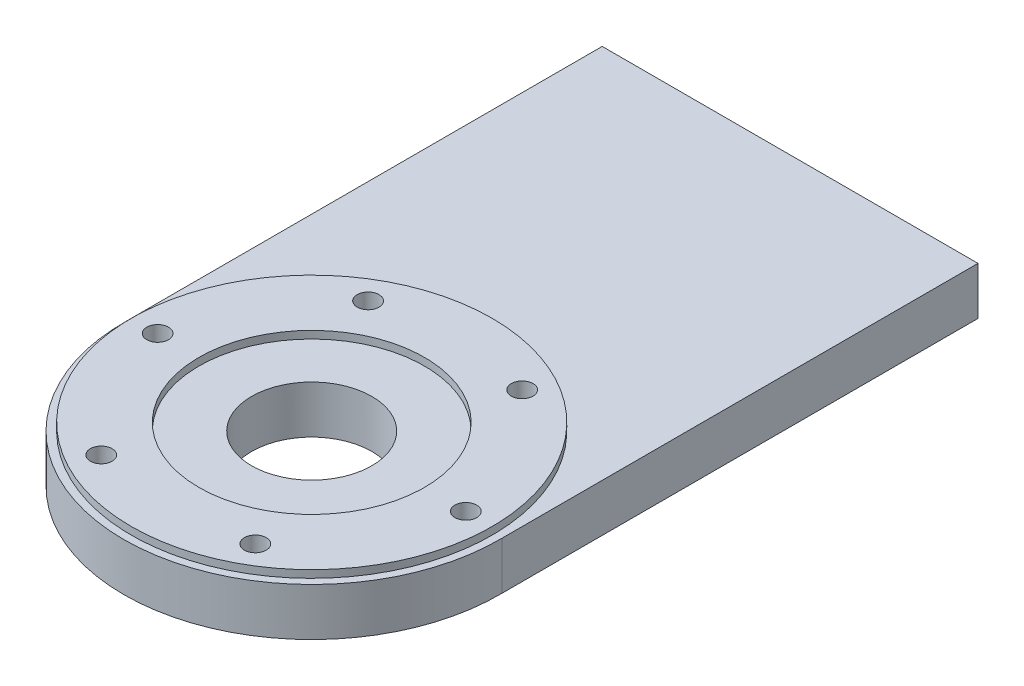
ISO-10303-21;
HEADER;
FILE_DESCRIPTION(('STEP AP214'),'2;1');
FILE_NAME('part.step','',(''),(''),'','','');
FILE_SCHEMA(('AUTOMOTIVE_DESIGN { 1 0 10303 214 1 1 1 1 }'));
ENDSEC;
DATA;
#1=APPLICATION_CONTEXT('core data for automotive mechanical design processes');
#2=APPLICATION_PROTOCOL_DEFINITION('international standard','automotive_design',2000,#1);
#3=PRODUCT_CONTEXT('',#1,'mechanical');
#4=PRODUCT('Part','Part','',(#3));
#5=PRODUCT_RELATED_PRODUCT_CATEGORY('part','',(#4));
#6=PRODUCT_DEFINITION_FORMATION('','',#4);
#7=PRODUCT_DEFINITION_CONTEXT('part definition',#1,'design');
#8=PRODUCT_DEFINITION('design','',#6,#7);
#9=PRODUCT_DEFINITION_SHAPE('','',#8);
#10=(LENGTH_UNIT() NAMED_UNIT(*) SI_UNIT(.MILLI.,.METRE.));
#11=(NAMED_UNIT(*) PLANE_ANGLE_UNIT() SI_UNIT($,.RADIAN.));
#12=(NAMED_UNIT(*) SI_UNIT($,.STERADIAN.) SOLID_ANGLE_UNIT());
#13=UNCERTAINTY_MEASURE_WITH_UNIT(LENGTH_MEASURE(1.E-05),#10,'distance_accuracy_value','');
#14=(GEOMETRIC_REPRESENTATION_CONTEXT(3) GLOBAL_UNCERTAINTY_ASSIGNED_CONTEXT((#13)) GLOBAL_UNIT_ASSIGNED_CONTEXT((#10,
#11,#12)) REPRESENTATION_CONTEXT('',''));
#15=CARTESIAN_POINT('',(0.,0.,0.));
#16=DIRECTION('',(0.,0.,1.));
#17=DIRECTION('',(1.,0.,0.));
#18=AXIS2_PLACEMENT_3D('',#15,#16,#17);
#19=CARTESIAN_POINT('',(-25.,-21.5,489.65));
#20=DIRECTION('',(0.,0.,-1.));
#21=DIRECTION('',(-1.,0.,0.));
#22=AXIS2_PLACEMENT_3D('',#19,#20,#21);
#23=PLANE('',#22);
#24=DIRECTION('',(0.,-1.,0.));
#25=VECTOR('',#24,1.);
#26=CARTESIAN_POINT('',(24.9975498799382,-21.5,489.65));
#27=LINE('',#26,#25);
#28=CARTESIAN_POINT('',(24.9975498799382,-27.85,489.65));
#29=VERTEX_POINT('',#28);
#30=CARTESIAN_POINT('',(24.9975498799382,-21.5,489.65));
#31=VERTEX_POINT('',#30);
#32=EDGE_CURVE('E111',#29,#31,#27,.F.);
#33=ORIENTED_EDGE('',*,*,#32,.F.);
#34=DIRECTION('',(1.,0.,0.));
#35=VECTOR('',#34,1.);
#36=CARTESIAN_POINT('',(-25.,-27.85,489.65));
#37=LINE('',#36,#35);
#38=CARTESIAN_POINT('',(25.,-27.85,489.65));
#39=VERTEX_POINT('',#38);
#40=EDGE_CURVE('E105',#29,#39,#37,.T.);
#41=ORIENTED_EDGE('',*,*,#40,.T.);
#42=DIRECTION('',(0.,-1.,0.));
#43=VECTOR('',#42,1.);
#44=CARTESIAN_POINT('',(25.,-21.5,489.65));
#45=LINE('',#44,#43);
#46=CARTESIAN_POINT('',(25.,-21.5,489.65));
#47=VERTEX_POINT('',#46);
#48=EDGE_CURVE('E133',#47,#39,#45,.T.);
#49=ORIENTED_EDGE('',*,*,#48,.F.);
#50=DIRECTION('',(1.,0.,0.));
#51=VECTOR('',#50,1.);
#52=CARTESIAN_POINT('',(-25.,-21.5,489.65));
#53=LINE('',#52,#51);
#54=EDGE_CURVE('E57',#31,#47,#53,.T.);
#55=ORIENTED_EDGE('',*,*,#54,.F.);
#56=EDGE_LOOP('',(#33,#41,#49,#55));
#57=FACE_BOUND('',#56,.T.);
#58=ADVANCED_FACE('F39',(#57),#23,.F.);
#59=DIRECTION('',(0.,-1.,0.));
#60=VECTOR('',#59,1.);
#61=CARTESIAN_POINT('',(-24.9975498799382,-21.5,489.65));
#62=LINE('',#61,#60);
#63=CARTESIAN_POINT('',(-24.9975498799382,-21.5,489.65));
#64=VERTEX_POINT('',#63);
#65=CARTESIAN_POINT('',(-24.9975498799382,-27.85,489.65));
#66=VERTEX_POINT('',#65);
#67=EDGE_CURVE('E64',#64,#66,#62,.T.);
#68=ORIENTED_EDGE('',*,*,#67,.F.);
#69=CARTESIAN_POINT('',(-25.,-21.5,489.65));
#70=VERTEX_POINT('',#69);
#71=EDGE_CURVE('E131',#70,#64,#53,.T.);
#72=ORIENTED_EDGE('',*,*,#71,.F.);
#73=DIRECTION('',(0.,-1.,0.));
#74=VECTOR('',#73,1.);
#75=CARTESIAN_POINT('',(-25.,-21.5,489.65));
#76=LINE('',#75,#74);
#77=CARTESIAN_POINT('',(-25.,-27.85,489.65));
#78=VERTEX_POINT('',#77);
#79=EDGE_CURVE('E97',#70,#78,#76,.T.);
#80=ORIENTED_EDGE('',*,*,#79,.T.);
#81=EDGE_CURVE('E94',#78,#66,#37,.T.);
#82=ORIENTED_EDGE('',*,*,#81,.T.);
#83=EDGE_LOOP('',(#68,#72,#80,#82));
#84=FACE_BOUND('',#83,.T.);
#85=ADVANCED_FACE('F91',(#84),#23,.F.);
#86=CARTESIAN_POINT('',(25.,-21.5,489.65));
#87=DIRECTION('',(-1.,0.,0.));
#88=DIRECTION('',(0.,0.,1.));
#89=AXIS2_PLACEMENT_3D('',#86,#87,#88);
#90=PLANE('',#89);
#91=DIRECTION('',(0.,0.,-1.));
#92=VECTOR('',#91,1.);
#93=CARTESIAN_POINT('',(25.,-27.85,489.65));
#94=LINE('',#93,#92);
#95=CARTESIAN_POINT('',(25.,-27.85,426.35));
#96=VERTEX_POINT('',#95);
#97=EDGE_CURVE('E121',#39,#96,#94,.T.);
#98=ORIENTED_EDGE('',*,*,#97,.T.);
#99=DIRECTION('',(0.,-1.,0.));
#100=VECTOR('',#99,1.);
#101=CARTESIAN_POINT('',(25.,-21.5,426.35));
#102=LINE('',#101,#100);
#103=CARTESIAN_POINT('',(25.,-21.5,426.35));
#104=VERTEX_POINT('',#103);
#105=EDGE_CURVE('E48',#104,#96,#102,.T.);
#106=ORIENTED_EDGE('',*,*,#105,.F.);
#107=DIRECTION('',(0.,0.,-1.));
#108=VECTOR('',#107,1.);
#109=CARTESIAN_POINT('',(25.,-21.5,489.65));
#110=LINE('',#109,#108);
#111=EDGE_CURVE('E103',#47,#104,#110,.T.);
#112=ORIENTED_EDGE('',*,*,#111,.F.);
#113=ORIENTED_EDGE('',*,*,#48,.T.);
#114=EDGE_LOOP('',(#98,#106,#112,#113));
#115=FACE_BOUND('',#114,.T.);
#116=ADVANCED_FACE('F41',(#115),#90,.F.);
#117=CARTESIAN_POINT('',(-25.,-21.5,426.35));
#118=DIRECTION('',(0.,0.,1.));
#119=DIRECTION('',(1.,0.,0.));
#120=AXIS2_PLACEMENT_3D('',#117,#118,#119);
#121=PLANE('',#120);
#122=CARTESIAN_POINT('',(-15.,-24.675,426.35));
#123=DIRECTION('',(0.,0.,-1.));
#124=DIRECTION('',(-1.,0.,0.));
#125=AXIS2_PLACEMENT_3D('',#122,#123,#124);
#126=CIRCLE('',#125,1.25);
#127=CARTESIAN_POINT('',(-16.25,-24.675,426.35));
#128=VERTEX_POINT('',#127);
#129=EDGE_CURVE('E245',#128,#128,#126,.T.);
#130=ORIENTED_EDGE('',*,*,#129,.F.);
#131=EDGE_LOOP('',(#130));
#132=FACE_BOUND('',#131,.T.);
#133=CARTESIAN_POINT('',(15.,-24.675,426.35));
#134=DIRECTION('',(0.,0.,-1.));
#135=DIRECTION('',(-1.,0.,0.));
#136=AXIS2_PLACEMENT_3D('',#133,#134,#135);
#137=CIRCLE('',#136,1.25);
#138=CARTESIAN_POINT('',(13.75,-24.675,426.35));
#139=VERTEX_POINT('',#138);
#140=EDGE_CURVE('E246',#139,#139,#137,.T.);
#141=ORIENTED_EDGE('',*,*,#140,.F.);
#142=EDGE_LOOP('',(#141));
#143=FACE_BOUND('',#142,.T.);
#144=DIRECTION('',(-1.,0.,0.));
#145=VECTOR('',#144,1.);
#146=CARTESIAN_POINT('',(-25.,-27.85,426.35));
#147=LINE('',#146,#145);
#148=CARTESIAN_POINT('',(-25.,-27.85,426.35));
#149=VERTEX_POINT('',#148);
#150=EDGE_CURVE('E137',#96,#149,#147,.T.);
#151=ORIENTED_EDGE('',*,*,#150,.T.);
#152=DIRECTION('',(0.,-1.,0.));
#153=VECTOR('',#152,1.);
#154=CARTESIAN_POINT('',(-25.,-21.5,426.35));
#155=LINE('',#154,#153);
#156=CARTESIAN_POINT('',(-25.,-21.5,426.35));
#157=VERTEX_POINT('',#156);
#158=EDGE_CURVE('E141',#157,#149,#155,.T.);
#159=ORIENTED_EDGE('',*,*,#158,.F.);
#160=DIRECTION('',(-1.,0.,0.));
#161=VECTOR('',#160,1.);
#162=CARTESIAN_POINT('',(-25.,-21.5,426.35));
#163=LINE('',#162,#161);
#164=EDGE_CURVE('E130',#104,#157,#163,.T.);
#165=ORIENTED_EDGE('',*,*,#164,.F.);
#166=ORIENTED_EDGE('',*,*,#105,.T.);
#167=EDGE_LOOP('',(#151,#159,#165,#166));
#168=FACE_BOUND('',#167,.T.);
#169=ADVANCED_FACE('F229',(#132,#143,#168),#121,.F.);
#170=CARTESIAN_POINT('',(-25.,-21.5,489.65));
#171=DIRECTION('',(1.,0.,0.));
#172=DIRECTION('',(0.,0.,-1.));
#173=AXIS2_PLACEMENT_3D('',#170,#171,#172);
#174=PLANE('',#173);
#175=DIRECTION('',(0.,0.,1.));
#176=VECTOR('',#175,1.);
#177=CARTESIAN_POINT('',(-25.,-27.85,489.65));
#178=LINE('',#177,#176);
#179=EDGE_CURVE('E138',#149,#78,#178,.T.);
#180=ORIENTED_EDGE('',*,*,#179,.T.);
#181=ORIENTED_EDGE('',*,*,#79,.F.);
#182=DIRECTION('',(0.,0.,1.));
#183=VECTOR('',#182,1.);
#184=CARTESIAN_POINT('',(-25.,-21.5,489.65));
#185=LINE('',#184,#183);
#186=EDGE_CURVE('E129',#157,#70,#185,.T.);
#187=ORIENTED_EDGE('',*,*,#186,.F.);
#188=ORIENTED_EDGE('',*,*,#158,.T.);
#189=EDGE_LOOP('',(#180,#181,#187,#188));
#190=FACE_BOUND('',#189,.T.);
#191=ADVANCED_FACE('F226',(#190),#174,.F.);
#192=CARTESIAN_POINT('',(0.,-21.5,0.));
#193=DIRECTION('',(0.,-1.,0.));
#194=DIRECTION('',(0.,0.,-1.));
#195=AXIS2_PLACEMENT_3D('',#192,#193,#194);
#196=PLANE('',#195);
#197=CARTESIAN_POINT('',(0.,-21.5,490.));
#198=DIRECTION('',(0.,-1.,0.));
#199=DIRECTION('',(0.,0.,-1.));
#200=AXIS2_PLACEMENT_3D('',#197,#198,#199);
#201=CIRCLE('',#200,24.);
#202=CARTESIAN_POINT('',(0.,-21.5,466.));
#203=VERTEX_POINT('',#202);
#204=EDGE_CURVE('E11',#203,#203,#201,.F.);
#205=ORIENTED_EDGE('',*,*,#204,.F.);
#206=EDGE_LOOP('',(#205));
#207=FACE_BOUND('',#206,.T.);
#208=ORIENTED_EDGE('',*,*,#71,.T.);
#209=CARTESIAN_POINT('',(0.,-21.5,490.));
#210=DIRECTION('',(0.,1.,0.));
#211=DIRECTION('',(0.,0.,1.));
#212=AXIS2_PLACEMENT_3D('',#209,#210,#211);
#213=CIRCLE('',#212,25.);
#214=EDGE_CURVE('E109',#64,#31,#213,.T.);
#215=ORIENTED_EDGE('',*,*,#214,.T.);
#216=ORIENTED_EDGE('',*,*,#54,.T.);
#217=ORIENTED_EDGE('',*,*,#111,.T.);
#218=ORIENTED_EDGE('',*,*,#164,.T.);
#219=ORIENTED_EDGE('',*,*,#186,.T.);
#220=EDGE_LOOP('',(#208,#215,#216,#217,#218,#219));
#221=FACE_BOUND('',#220,.T.);
#222=ADVANCED_FACE('F214',(#207,#221),#196,.F.);
#223=CARTESIAN_POINT('',(0.,-27.85,0.));
#224=DIRECTION('',(0.,-1.,0.));
#225=DIRECTION('',(0.,0.,-1.));
#226=AXIS2_PLACEMENT_3D('',#223,#224,#225);
#227=PLANE('',#226);
#228=CARTESIAN_POINT('',(10.25,-27.85,472.246479222419));
#229=DIRECTION('',(0.,1.,0.));
#230=DIRECTION('',(0.,0.,1.));
#231=AXIS2_PLACEMENT_3D('',#228,#229,#230);
#232=CIRCLE('',#231,2.75);
#233=CARTESIAN_POINT('',(10.25,-27.85,474.996479222419));
#234=VERTEX_POINT('',#233);
#235=EDGE_CURVE('E328',#234,#234,#232,.T.);
#236=ORIENTED_EDGE('',*,*,#235,.T.);
#237=EDGE_LOOP('',(#236));
#238=FACE_BOUND('',#237,.T.);
#239=CARTESIAN_POINT('',(-10.25,-27.85,472.246479222419));
#240=DIRECTION('',(0.,1.,0.));
#241=DIRECTION('',(0.,0.,1.));
#242=AXIS2_PLACEMENT_3D('',#239,#240,#241);
#243=CIRCLE('',#242,2.75);
#244=CARTESIAN_POINT('',(-10.25,-27.85,474.996479222419));
#245=VERTEX_POINT('',#244);
#246=EDGE_CURVE('E330',#245,#245,#243,.T.);
#247=ORIENTED_EDGE('',*,*,#246,.T.);
#248=EDGE_LOOP('',(#247));
#249=FACE_BOUND('',#248,.T.);
#250=CARTESIAN_POINT('',(-10.25,-27.85,507.753520777581));
#251=DIRECTION('',(0.,1.,0.));
#252=DIRECTION('',(0.,0.,1.));
#253=AXIS2_PLACEMENT_3D('',#250,#251,#252);
#254=CIRCLE('',#253,2.75);
#255=CARTESIAN_POINT('',(-10.25,-27.85,510.503520777581));
#256=VERTEX_POINT('',#255);
#257=EDGE_CURVE('E342',#256,#256,#254,.T.);
#258=ORIENTED_EDGE('',*,*,#257,.T.);
#259=EDGE_LOOP('',(#258));
#260=FACE_BOUND('',#259,.T.);
#261=CARTESIAN_POINT('',(10.25,-27.85,507.753520777581));
#262=DIRECTION('',(0.,1.,0.));
#263=DIRECTION('',(0.,0.,1.));
#264=AXIS2_PLACEMENT_3D('',#261,#262,#263);
#265=CIRCLE('',#264,2.75);
#266=CARTESIAN_POINT('',(10.25,-27.85,510.503520777581));
#267=VERTEX_POINT('',#266);
#268=EDGE_CURVE('E341',#267,#267,#265,.T.);
#269=ORIENTED_EDGE('',*,*,#268,.T.);
#270=EDGE_LOOP('',(#269));
#271=FACE_BOUND('',#270,.T.);
#272=CARTESIAN_POINT('',(20.5,-27.85,490.));
#273=DIRECTION('',(0.,1.,0.));
#274=DIRECTION('',(0.,0.,1.));
#275=AXIS2_PLACEMENT_3D('',#272,#273,#274);
#276=CIRCLE('',#275,1.45);
#277=CARTESIAN_POINT('',(20.5,-27.85,491.45));
#278=VERTEX_POINT('',#277);
#279=EDGE_CURVE('E180',#278,#278,#276,.T.);
#280=ORIENTED_EDGE('',*,*,#279,.T.);
#281=EDGE_LOOP('',(#280));
#282=FACE_BOUND('',#281,.T.);
#283=CARTESIAN_POINT('',(-20.5,-27.85,490.));
#284=DIRECTION('',(0.,1.,0.));
#285=DIRECTION('',(0.,0.,1.));
#286=AXIS2_PLACEMENT_3D('',#283,#284,#285);
#287=CIRCLE('',#286,1.45);
#288=CARTESIAN_POINT('',(-20.5,-27.85,491.45));
#289=VERTEX_POINT('',#288);
#290=EDGE_CURVE('E184',#289,#289,#287,.T.);
#291=ORIENTED_EDGE('',*,*,#290,.T.);
#292=EDGE_LOOP('',(#291));
#293=FACE_BOUND('',#292,.T.);
#294=CARTESIAN_POINT('',(0.,-27.85,490.));
#295=DIRECTION('',(0.,1.,0.));
#296=DIRECTION('',(0.,0.,1.));
#297=AXIS2_PLACEMENT_3D('',#294,#295,#296);
#298=CIRCLE('',#297,8.);
#299=CARTESIAN_POINT('',(0.,-27.85,498.));
#300=VERTEX_POINT('',#299);
#301=EDGE_CURVE('E155',#300,#300,#298,.T.);
#302=ORIENTED_EDGE('',*,*,#301,.T.);
#303=EDGE_LOOP('',(#302));
#304=FACE_BOUND('',#303,.T.);
#305=ORIENTED_EDGE('',*,*,#40,.F.);
#306=CARTESIAN_POINT('',(0.,-27.85,490.));
#307=DIRECTION('',(0.,1.,0.));
#308=DIRECTION('',(0.,0.,1.));
#309=AXIS2_PLACEMENT_3D('',#306,#307,#308);
#310=CIRCLE('',#309,25.);
#311=EDGE_CURVE('E108',#66,#29,#310,.T.);
#312=ORIENTED_EDGE('',*,*,#311,.F.);
#313=ORIENTED_EDGE('',*,*,#81,.F.);
#314=ORIENTED_EDGE('',*,*,#179,.F.);
#315=ORIENTED_EDGE('',*,*,#150,.F.);
#316=ORIENTED_EDGE('',*,*,#97,.F.);
#317=EDGE_LOOP('',(#305,#312,#313,#314,#315,#316));
#318=FACE_BOUND('',#317,.T.);
#319=ADVANCED_FACE('F112',(#238,#249,#260,#271,#282,#293,#304,#318),#227,.T.);
#320=CARTESIAN_POINT('',(0.,-21.5,490.));
#321=DIRECTION('',(0.,-1.,0.));
#322=DIRECTION('',(0.,0.,-1.));
#323=AXIS2_PLACEMENT_3D('',#320,#321,#322);
#324=CYLINDRICAL_SURFACE('',#323,25.);
#325=ORIENTED_EDGE('',*,*,#311,.T.);
#326=ORIENTED_EDGE('',*,*,#32,.T.);
#327=ORIENTED_EDGE('',*,*,#214,.F.);
#328=ORIENTED_EDGE('',*,*,#67,.T.);
#329=EDGE_LOOP('',(#325,#326,#327,#328));
#330=FACE_BOUND('',#329,.T.);
#331=ADVANCED_FACE('F110',(#330),#324,.T.);
#332=CARTESIAN_POINT('',(0.,-20.5,490.));
#333=DIRECTION('',(0.,1.,0.));
#334=DIRECTION('',(0.,0.,1.));
#335=AXIS2_PLACEMENT_3D('',#332,#333,#334);
#336=PLANE('',#335);
#337=CARTESIAN_POINT('',(20.5,-20.5,490.));
#338=DIRECTION('',(0.,1.,0.));
#339=DIRECTION('',(0.,0.,1.));
#340=AXIS2_PLACEMENT_3D('',#337,#338,#339);
#341=CIRCLE('',#340,1.45);
#342=CARTESIAN_POINT('',(20.5,-20.5,491.45));
#343=VERTEX_POINT('',#342);
#344=EDGE_CURVE('E195',#343,#343,#341,.T.);
#345=ORIENTED_EDGE('',*,*,#344,.F.);
#346=EDGE_LOOP('',(#345));
#347=FACE_BOUND('',#346,.T.);
#348=CARTESIAN_POINT('',(10.25,-20.5,472.246479222419));
#349=DIRECTION('',(0.,1.,0.));
#350=DIRECTION('',(0.,0.,1.));
#351=AXIS2_PLACEMENT_3D('',#348,#349,#350);
#352=CIRCLE('',#351,1.45);
#353=CARTESIAN_POINT('',(10.25,-20.5,473.696479222419));
#354=VERTEX_POINT('',#353);
#355=EDGE_CURVE('E165',#354,#354,#352,.T.);
#356=ORIENTED_EDGE('',*,*,#355,.F.);
#357=EDGE_LOOP('',(#356));
#358=FACE_BOUND('',#357,.T.);
#359=CARTESIAN_POINT('',(-10.25,-20.5,472.246479222419));
#360=DIRECTION('',(0.,1.,0.));
#361=DIRECTION('',(0.,0.,1.));
#362=AXIS2_PLACEMENT_3D('',#359,#360,#361);
#363=CIRCLE('',#362,1.45);
#364=CARTESIAN_POINT('',(-10.25,-20.5,473.696479222419));
#365=VERTEX_POINT('',#364);
#366=EDGE_CURVE('E166',#365,#365,#363,.T.);
#367=ORIENTED_EDGE('',*,*,#366,.F.);
#368=EDGE_LOOP('',(#367));
#369=FACE_BOUND('',#368,.T.);
#370=CARTESIAN_POINT('',(-20.5,-20.5,490.));
#371=DIRECTION('',(0.,1.,0.));
#372=DIRECTION('',(0.,0.,1.));
#373=AXIS2_PLACEMENT_3D('',#370,#371,#372);
#374=CIRCLE('',#373,1.45);
#375=CARTESIAN_POINT('',(-20.5,-20.5,491.45));
#376=VERTEX_POINT('',#375);
#377=EDGE_CURVE('E173',#376,#376,#374,.T.);
#378=ORIENTED_EDGE('',*,*,#377,.F.);
#379=EDGE_LOOP('',(#378));
#380=FACE_BOUND('',#379,.T.);
#381=CARTESIAN_POINT('',(-10.25,-20.5,507.753520777581));
#382=DIRECTION('',(0.,1.,0.));
#383=DIRECTION('',(0.,0.,1.));
#384=AXIS2_PLACEMENT_3D('',#381,#382,#383);
#385=CIRCLE('',#384,1.45);
#386=CARTESIAN_POINT('',(-10.25,-20.5,509.203520777581));
#387=VERTEX_POINT('',#386);
#388=EDGE_CURVE('E185',#387,#387,#385,.T.);
#389=ORIENTED_EDGE('',*,*,#388,.F.);
#390=EDGE_LOOP('',(#389));
#391=FACE_BOUND('',#390,.T.);
#392=CARTESIAN_POINT('',(10.25,-20.5,507.753520777581));
#393=DIRECTION('',(0.,1.,0.));
#394=DIRECTION('',(0.,0.,1.));
#395=AXIS2_PLACEMENT_3D('',#392,#393,#394);
#396=CIRCLE('',#395,1.45);
#397=CARTESIAN_POINT('',(10.25,-20.5,509.203520777581));
#398=VERTEX_POINT('',#397);
#399=EDGE_CURVE('E177',#398,#398,#396,.T.);
#400=ORIENTED_EDGE('',*,*,#399,.F.);
#401=EDGE_LOOP('',(#400));
#402=FACE_BOUND('',#401,.T.);
#403=CARTESIAN_POINT('',(0.,-20.5,490.));
#404=DIRECTION('',(0.,1.,0.));
#405=DIRECTION('',(0.,0.,1.));
#406=AXIS2_PLACEMENT_3D('',#403,#404,#405);
#407=CIRCLE('',#406,24.);
#408=CARTESIAN_POINT('',(0.,-20.5,514.));
#409=VERTEX_POINT('',#408);
#410=EDGE_CURVE('E116',#409,#409,#407,.T.);
#411=ORIENTED_EDGE('',*,*,#410,.T.);
#412=EDGE_LOOP('',(#411));
#413=FACE_BOUND('',#412,.T.);
#414=CARTESIAN_POINT('',(0.,-20.5,490.));
#415=DIRECTION('',(0.,1.,0.));
#416=DIRECTION('',(0.,0.,1.));
#417=AXIS2_PLACEMENT_3D('',#414,#415,#416);
#418=CIRCLE('',#417,15.);
#419=CARTESIAN_POINT('',(0.,-20.5,505.));
#420=VERTEX_POINT('',#419);
#421=EDGE_CURVE('E119',#420,#420,#418,.T.);
#422=ORIENTED_EDGE('',*,*,#421,.F.);
#423=EDGE_LOOP('',(#422));
#424=FACE_BOUND('',#423,.T.);
#425=ADVANCED_FACE('F212',(#347,#358,#369,#380,#391,#402,#413,#424),#336,.T.);
#426=CARTESIAN_POINT('',(0.,-20.5,490.));
#427=DIRECTION('',(0.,-1.,0.));
#428=DIRECTION('',(0.,0.,-1.));
#429=AXIS2_PLACEMENT_3D('',#426,#427,#428);
#430=CYLINDRICAL_SURFACE('',#429,24.);
#431=ORIENTED_EDGE('',*,*,#410,.F.);
#432=EDGE_LOOP('',(#431));
#433=FACE_BOUND('',#432,.T.);
#434=ORIENTED_EDGE('',*,*,#204,.T.);
#435=EDGE_LOOP('',(#434));
#436=FACE_BOUND('',#435,.T.);
#437=ADVANCED_FACE('F205',(#433,#436),#430,.T.);
#438=CARTESIAN_POINT('',(0.,-20.5,490.));
#439=DIRECTION('',(0.,-1.,0.));
#440=DIRECTION('',(0.,0.,-1.));
#441=AXIS2_PLACEMENT_3D('',#438,#439,#440);
#442=CYLINDRICAL_SURFACE('',#441,15.);
#443=ORIENTED_EDGE('',*,*,#421,.T.);
#444=EDGE_LOOP('',(#443));
#445=FACE_BOUND('',#444,.T.);
#446=CARTESIAN_POINT('',(0.,-21.5,490.));
#447=DIRECTION('',(0.,1.,0.));
#448=DIRECTION('',(0.,0.,1.));
#449=AXIS2_PLACEMENT_3D('',#446,#447,#448);
#450=CIRCLE('',#449,15.);
#451=CARTESIAN_POINT('',(0.,-21.5,505.));
#452=VERTEX_POINT('',#451);
#453=EDGE_CURVE('E151',#452,#452,#450,.T.);
#454=ORIENTED_EDGE('',*,*,#453,.F.);
#455=EDGE_LOOP('',(#454));
#456=FACE_BOUND('',#455,.T.);
#457=ADVANCED_FACE('F199',(#445,#456),#442,.F.);
#458=CARTESIAN_POINT('',(0.,-21.5,490.));
#459=DIRECTION('',(0.,-1.,0.));
#460=DIRECTION('',(0.,0.,-1.));
#461=AXIS2_PLACEMENT_3D('',#458,#459,#460);
#462=CIRCLE('',#461,8.);
#463=CARTESIAN_POINT('',(0.,-21.5,482.));
#464=VERTEX_POINT('',#463);
#465=EDGE_CURVE('E146',#464,#464,#462,.F.);
#466=ORIENTED_EDGE('',*,*,#465,.F.);
#467=EDGE_LOOP('',(#466));
#468=FACE_BOUND('',#467,.T.);
#469=ORIENTED_EDGE('',*,*,#453,.T.);
#470=EDGE_LOOP('',(#469));
#471=FACE_BOUND('',#470,.T.);
#472=ADVANCED_FACE('F198',(#468,#471),#196,.F.);
#473=CARTESIAN_POINT('',(0.,-20.5,490.));
#474=DIRECTION('',(0.,-1.,0.));
#475=DIRECTION('',(0.,0.,-1.));
#476=AXIS2_PLACEMENT_3D('',#473,#474,#475);
#477=CYLINDRICAL_SURFACE('',#476,8.);
#478=ORIENTED_EDGE('',*,*,#301,.F.);
#479=EDGE_LOOP('',(#478));
#480=FACE_BOUND('',#479,.T.);
#481=ORIENTED_EDGE('',*,*,#465,.T.);
#482=EDGE_LOOP('',(#481));
#483=FACE_BOUND('',#482,.T.);
#484=ADVANCED_FACE('F213',(#480,#483),#477,.F.);
#485=CARTESIAN_POINT('',(10.25,-20.5,507.753520777581));
#486=DIRECTION('',(0.,-1.,0.));
#487=DIRECTION('',(0.,0.,-1.));
#488=AXIS2_PLACEMENT_3D('',#485,#486,#487);
#489=CYLINDRICAL_SURFACE('',#488,1.45);
#490=CARTESIAN_POINT('',(10.25,-25.35,507.753520777581));
#491=DIRECTION('',(0.,1.,0.));
#492=DIRECTION('',(0.,0.,1.));
#493=AXIS2_PLACEMENT_3D('',#490,#491,#492);
#494=CIRCLE('',#493,1.45);
#495=CARTESIAN_POINT('',(10.25,-25.35,509.203520777581));
#496=VERTEX_POINT('',#495);
#497=EDGE_CURVE('E43',#496,#496,#494,.T.);
#498=ORIENTED_EDGE('',*,*,#497,.F.);
#499=EDGE_LOOP('',(#498));
#500=FACE_BOUND('',#499,.T.);
#501=ORIENTED_EDGE('',*,*,#399,.T.);
#502=EDGE_LOOP('',(#501));
#503=FACE_BOUND('',#502,.T.);
#504=ADVANCED_FACE('F284',(#500,#503),#489,.F.);
#505=CARTESIAN_POINT('',(-10.25,-20.5,507.753520777581));
#506=DIRECTION('',(0.,-1.,0.));
#507=DIRECTION('',(0.,0.,-1.));
#508=AXIS2_PLACEMENT_3D('',#505,#506,#507);
#509=CYLINDRICAL_SURFACE('',#508,1.45);
#510=CARTESIAN_POINT('',(-10.25,-25.35,507.753520777581));
#511=DIRECTION('',(0.,1.,0.));
#512=DIRECTION('',(0.,0.,1.));
#513=AXIS2_PLACEMENT_3D('',#510,#511,#512);
#514=CIRCLE('',#513,1.45);
#515=CARTESIAN_POINT('',(-10.25,-25.35,509.203520777581));
#516=VERTEX_POINT('',#515);
#517=EDGE_CURVE('E159',#516,#516,#514,.T.);
#518=ORIENTED_EDGE('',*,*,#517,.F.);
#519=EDGE_LOOP('',(#518));
#520=FACE_BOUND('',#519,.T.);
#521=ORIENTED_EDGE('',*,*,#388,.T.);
#522=EDGE_LOOP('',(#521));
#523=FACE_BOUND('',#522,.T.);
#524=ADVANCED_FACE('F290',(#520,#523),#509,.F.);
#525=CARTESIAN_POINT('',(-20.5,-20.5,490.));
#526=DIRECTION('',(0.,-1.,0.));
#527=DIRECTION('',(0.,0.,-1.));
#528=AXIS2_PLACEMENT_3D('',#525,#526,#527);
#529=CYLINDRICAL_SURFACE('',#528,1.45);
#530=ORIENTED_EDGE('',*,*,#377,.T.);
#531=EDGE_LOOP('',(#530));
#532=FACE_BOUND('',#531,.T.);
#533=ORIENTED_EDGE('',*,*,#290,.F.);
#534=EDGE_LOOP('',(#533));
#535=FACE_BOUND('',#534,.T.);
#536=ADVANCED_FACE('F295',(#532,#535),#529,.F.);
#537=CARTESIAN_POINT('',(-10.25,-20.5,472.246479222419));
#538=DIRECTION('',(0.,-1.,0.));
#539=DIRECTION('',(0.,0.,-1.));
#540=AXIS2_PLACEMENT_3D('',#537,#538,#539);
#541=CYLINDRICAL_SURFACE('',#540,1.45);
#542=CARTESIAN_POINT('',(-10.25,-25.35,472.246479222419));
#543=DIRECTION('',(0.,1.,0.));
#544=DIRECTION('',(0.,0.,1.));
#545=AXIS2_PLACEMENT_3D('',#542,#543,#544);
#546=CIRCLE('',#545,1.45);
#547=CARTESIAN_POINT('',(-10.25,-25.35,473.696479222419));
#548=VERTEX_POINT('',#547);
#549=EDGE_CURVE('E157',#548,#548,#546,.T.);
#550=ORIENTED_EDGE('',*,*,#549,.F.);
#551=EDGE_LOOP('',(#550));
#552=FACE_BOUND('',#551,.T.);
#553=ORIENTED_EDGE('',*,*,#366,.T.);
#554=EDGE_LOOP('',(#553));
#555=FACE_BOUND('',#554,.T.);
#556=ADVANCED_FACE('F302',(#552,#555),#541,.F.);
#557=CARTESIAN_POINT('',(10.25,-20.5,472.246479222419));
#558=DIRECTION('',(0.,-1.,0.));
#559=DIRECTION('',(0.,0.,-1.));
#560=AXIS2_PLACEMENT_3D('',#557,#558,#559);
#561=CYLINDRICAL_SURFACE('',#560,1.45);
#562=CARTESIAN_POINT('',(10.25,-25.35,472.246479222419));
#563=DIRECTION('',(0.,1.,0.));
#564=DIRECTION('',(0.,0.,1.));
#565=AXIS2_PLACEMENT_3D('',#562,#563,#564);
#566=CIRCLE('',#565,1.45);
#567=CARTESIAN_POINT('',(10.25,-25.35,473.696479222419));
#568=VERTEX_POINT('',#567);
#569=EDGE_CURVE('E153',#568,#568,#566,.T.);
#570=ORIENTED_EDGE('',*,*,#569,.F.);
#571=EDGE_LOOP('',(#570));
#572=FACE_BOUND('',#571,.T.);
#573=ORIENTED_EDGE('',*,*,#355,.T.);
#574=EDGE_LOOP('',(#573));
#575=FACE_BOUND('',#574,.T.);
#576=ADVANCED_FACE('F299',(#572,#575),#561,.F.);
#577=CARTESIAN_POINT('',(20.5,-20.5,490.));
#578=DIRECTION('',(0.,-1.,0.));
#579=DIRECTION('',(0.,0.,-1.));
#580=AXIS2_PLACEMENT_3D('',#577,#578,#579);
#581=CYLINDRICAL_SURFACE('',#580,1.45);
#582=ORIENTED_EDGE('',*,*,#344,.T.);
#583=EDGE_LOOP('',(#582));
#584=FACE_BOUND('',#583,.T.);
#585=ORIENTED_EDGE('',*,*,#279,.F.);
#586=EDGE_LOOP('',(#585));
#587=FACE_BOUND('',#586,.T.);
#588=ADVANCED_FACE('F315',(#584,#587),#581,.F.);
#589=CARTESIAN_POINT('',(10.25,-25.35,472.246479222419));
#590=DIRECTION('',(0.,-1.,0.));
#591=DIRECTION('',(0.,0.,-1.));
#592=AXIS2_PLACEMENT_3D('',#589,#590,#591);
#593=CYLINDRICAL_SURFACE('',#592,2.75);
#594=CARTESIAN_POINT('',(10.25,-25.35,472.246479222419));
#595=DIRECTION('',(0.,1.,0.));
#596=DIRECTION('',(0.,0.,1.));
#597=AXIS2_PLACEMENT_3D('',#594,#595,#596);
#598=CIRCLE('',#597,2.75);
#599=CARTESIAN_POINT('',(10.25,-25.35,474.996479222419));
#600=VERTEX_POINT('',#599);
#601=EDGE_CURVE('E334',#600,#600,#598,.T.);
#602=ORIENTED_EDGE('',*,*,#601,.T.);
#603=EDGE_LOOP('',(#602));
#604=FACE_BOUND('',#603,.T.);
#605=ORIENTED_EDGE('',*,*,#235,.F.);
#606=EDGE_LOOP('',(#605));
#607=FACE_BOUND('',#606,.T.);
#608=ADVANCED_FACE('F353',(#604,#607),#593,.F.);
#609=CARTESIAN_POINT('',(10.25,-25.35,472.246479222419));
#610=DIRECTION('',(0.,1.,0.));
#611=DIRECTION('',(0.,0.,1.));
#612=AXIS2_PLACEMENT_3D('',#609,#610,#611);
#613=PLANE('',#612);
#614=ORIENTED_EDGE('',*,*,#569,.T.);
#615=EDGE_LOOP('',(#614));
#616=FACE_BOUND('',#615,.T.);
#617=ORIENTED_EDGE('',*,*,#601,.F.);
#618=EDGE_LOOP('',(#617));
#619=FACE_BOUND('',#618,.T.);
#620=ADVANCED_FACE('F356',(#616,#619),#613,.F.);
#621=CARTESIAN_POINT('',(-10.25,-25.35,472.246479222419));
#622=DIRECTION('',(0.,-1.,0.));
#623=DIRECTION('',(0.,0.,-1.));
#624=AXIS2_PLACEMENT_3D('',#621,#622,#623);
#625=CYLINDRICAL_SURFACE('',#624,2.75);
#626=CARTESIAN_POINT('',(-10.25,-25.35,472.246479222419));
#627=DIRECTION('',(0.,1.,0.));
#628=DIRECTION('',(0.,0.,1.));
#629=AXIS2_PLACEMENT_3D('',#626,#627,#628);
#630=CIRCLE('',#629,2.75);
#631=CARTESIAN_POINT('',(-10.25,-25.35,474.996479222419));
#632=VERTEX_POINT('',#631);
#633=EDGE_CURVE('E322',#632,#632,#630,.T.);
#634=ORIENTED_EDGE('',*,*,#633,.T.);
#635=EDGE_LOOP('',(#634));
#636=FACE_BOUND('',#635,.T.);
#637=ORIENTED_EDGE('',*,*,#246,.F.);
#638=EDGE_LOOP('',(#637));
#639=FACE_BOUND('',#638,.T.);
#640=ADVANCED_FACE('F323',(#636,#639),#625,.F.);
#641=CARTESIAN_POINT('',(-10.25,-25.35,472.246479222419));
#642=DIRECTION('',(0.,1.,0.));
#643=DIRECTION('',(0.,0.,1.));
#644=AXIS2_PLACEMENT_3D('',#641,#642,#643);
#645=PLANE('',#644);
#646=ORIENTED_EDGE('',*,*,#549,.T.);
#647=EDGE_LOOP('',(#646));
#648=FACE_BOUND('',#647,.T.);
#649=ORIENTED_EDGE('',*,*,#633,.F.);
#650=EDGE_LOOP('',(#649));
#651=FACE_BOUND('',#650,.T.);
#652=ADVANCED_FACE('F320',(#648,#651),#645,.F.);
#653=CARTESIAN_POINT('',(-10.25,-25.35,507.753520777581));
#654=DIRECTION('',(0.,-1.,0.));
#655=DIRECTION('',(0.,0.,-1.));
#656=AXIS2_PLACEMENT_3D('',#653,#654,#655);
#657=CYLINDRICAL_SURFACE('',#656,2.75);
#658=CARTESIAN_POINT('',(-10.25,-25.35,507.753520777581));
#659=DIRECTION('',(0.,1.,0.));
#660=DIRECTION('',(0.,0.,1.));
#661=AXIS2_PLACEMENT_3D('',#658,#659,#660);
#662=CIRCLE('',#661,2.75);
#663=CARTESIAN_POINT('',(-10.25,-25.35,510.503520777581));
#664=VERTEX_POINT('',#663);
#665=EDGE_CURVE('E332',#664,#664,#662,.T.);
#666=ORIENTED_EDGE('',*,*,#665,.T.);
#667=EDGE_LOOP('',(#666));
#668=FACE_BOUND('',#667,.T.);
#669=ORIENTED_EDGE('',*,*,#257,.F.);
#670=EDGE_LOOP('',(#669));
#671=FACE_BOUND('',#670,.T.);
#672=ADVANCED_FACE('F318',(#668,#671),#657,.F.);
#673=CARTESIAN_POINT('',(-10.25,-25.35,507.753520777581));
#674=DIRECTION('',(0.,1.,0.));
#675=DIRECTION('',(0.,0.,1.));
#676=AXIS2_PLACEMENT_3D('',#673,#674,#675);
#677=PLANE('',#676);
#678=ORIENTED_EDGE('',*,*,#517,.T.);
#679=EDGE_LOOP('',(#678));
#680=FACE_BOUND('',#679,.T.);
#681=ORIENTED_EDGE('',*,*,#665,.F.);
#682=EDGE_LOOP('',(#681));
#683=FACE_BOUND('',#682,.T.);
#684=ADVANCED_FACE('F366',(#680,#683),#677,.F.);
#685=CARTESIAN_POINT('',(10.25,-25.35,507.753520777581));
#686=DIRECTION('',(0.,-1.,0.));
#687=DIRECTION('',(0.,0.,-1.));
#688=AXIS2_PLACEMENT_3D('',#685,#686,#687);
#689=CYLINDRICAL_SURFACE('',#688,2.75);
#690=CARTESIAN_POINT('',(10.25,-25.35,507.753520777581));
#691=DIRECTION('',(0.,1.,0.));
#692=DIRECTION('',(0.,0.,1.));
#693=AXIS2_PLACEMENT_3D('',#690,#691,#692);
#694=CIRCLE('',#693,2.75);
#695=CARTESIAN_POINT('',(10.25,-25.35,510.503520777581));
#696=VERTEX_POINT('',#695);
#697=EDGE_CURVE('E160',#696,#696,#694,.T.);
#698=ORIENTED_EDGE('',*,*,#697,.T.);
#699=EDGE_LOOP('',(#698));
#700=FACE_BOUND('',#699,.T.);
#701=ORIENTED_EDGE('',*,*,#268,.F.);
#702=EDGE_LOOP('',(#701));
#703=FACE_BOUND('',#702,.T.);
#704=ADVANCED_FACE('F365',(#700,#703),#689,.F.);
#705=CARTESIAN_POINT('',(10.25,-25.35,507.753520777581));
#706=DIRECTION('',(0.,1.,0.));
#707=DIRECTION('',(0.,0.,1.));
#708=AXIS2_PLACEMENT_3D('',#705,#706,#707);
#709=PLANE('',#708);
#710=ORIENTED_EDGE('',*,*,#497,.T.);
#711=EDGE_LOOP('',(#710));
#712=FACE_BOUND('',#711,.T.);
#713=ORIENTED_EDGE('',*,*,#697,.F.);
#714=EDGE_LOOP('',(#713));
#715=FACE_BOUND('',#714,.T.);
#716=ADVANCED_FACE('F362',(#712,#715),#709,.F.);
#717=CARTESIAN_POINT('',(15.,-24.675,435.35));
#718=DIRECTION('',(0.,0.,-1.));
#719=DIRECTION('',(-1.,0.,0.));
#720=AXIS2_PLACEMENT_3D('',#717,#718,#719);
#721=CYLINDRICAL_SURFACE('',#720,1.25);
#722=CARTESIAN_POINT('',(15.,-24.675,435.35));
#723=DIRECTION('',(0.,0.,-1.));
#724=DIRECTION('',(-1.,0.,0.));
#725=AXIS2_PLACEMENT_3D('',#722,#723,#724);
#726=CIRCLE('',#725,1.25);
#727=CARTESIAN_POINT('',(13.75,-24.675,435.35));
#728=VERTEX_POINT('',#727);
#729=EDGE_CURVE('E404',#728,#728,#726,.T.);
#730=ORIENTED_EDGE('',*,*,#729,.F.);
#731=EDGE_LOOP('',(#730));
#732=FACE_BOUND('',#731,.T.);
#733=ORIENTED_EDGE('',*,*,#140,.T.);
#734=EDGE_LOOP('',(#733));
#735=FACE_BOUND('',#734,.T.);
#736=ADVANCED_FACE('F369',(#732,#735),#721,.F.);
#737=CARTESIAN_POINT('',(15.,-24.675,435.35));
#738=DIRECTION('',(0.,0.,-1.));
#739=DIRECTION('',(-1.,0.,0.));
#740=AXIS2_PLACEMENT_3D('',#737,#738,#739);
#741=PLANE('',#740);
#742=ORIENTED_EDGE('',*,*,#729,.T.);
#743=EDGE_LOOP('',(#742));
#744=FACE_BOUND('',#743,.T.);
#745=ADVANCED_FACE('F382',(#744),#741,.T.);
#746=CARTESIAN_POINT('',(-15.,-24.675,435.35));
#747=DIRECTION('',(0.,0.,-1.));
#748=DIRECTION('',(-1.,0.,0.));
#749=AXIS2_PLACEMENT_3D('',#746,#747,#748);
#750=CYLINDRICAL_SURFACE('',#749,1.25);
#751=CARTESIAN_POINT('',(-15.,-24.675,435.35));
#752=DIRECTION('',(0.,0.,-1.));
#753=DIRECTION('',(-1.,0.,0.));
#754=AXIS2_PLACEMENT_3D('',#751,#752,#753);
#755=CIRCLE('',#754,1.25);
#756=CARTESIAN_POINT('',(-16.25,-24.675,435.35));
#757=VERTEX_POINT('',#756);
#758=EDGE_CURVE('E338',#757,#757,#755,.T.);
#759=ORIENTED_EDGE('',*,*,#758,.F.);
#760=EDGE_LOOP('',(#759));
#761=FACE_BOUND('',#760,.T.);
#762=ORIENTED_EDGE('',*,*,#129,.T.);
#763=EDGE_LOOP('',(#762));
#764=FACE_BOUND('',#763,.T.);
#765=ADVANCED_FACE('F381',(#761,#764),#750,.F.);
#766=CARTESIAN_POINT('',(-15.,-24.675,435.35));
#767=DIRECTION('',(0.,0.,-1.));
#768=DIRECTION('',(-1.,0.,0.));
#769=AXIS2_PLACEMENT_3D('',#766,#767,#768);
#770=PLANE('',#769);
#771=ORIENTED_EDGE('',*,*,#758,.T.);
#772=EDGE_LOOP('',(#771));
#773=FACE_BOUND('',#772,.T.);
#774=ADVANCED_FACE('F391',(#773),#770,.T.);
#775=CLOSED_SHELL('',(#58,#85,#116,#169,#191,#222,#319,#331,#425,#437,#457,#472,#484,#504,#524,
#536,#556,#576,#588,#608,#620,#640,#652,#672,#684,#704,#716,#736,#745,#765,#774));
#776=MANIFOLD_SOLID_BREP('B2',#775);
#777=ADVANCED_BREP_SHAPE_REPRESENTATION('',(#18,#776),#14);
#778=SHAPE_DEFINITION_REPRESENTATION(#9,#777);
ENDSEC;
END-ISO-10303-21;
